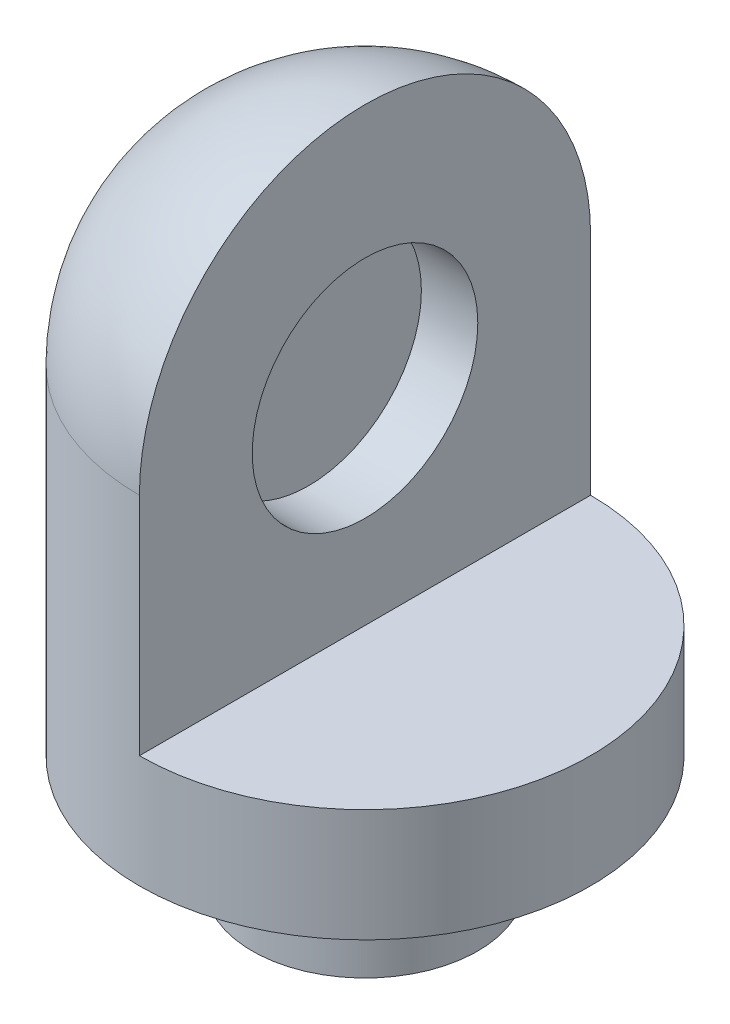
ISO-10303-21;
HEADER;
FILE_DESCRIPTION(('STEP AP214'),'2;1');
FILE_NAME('part.step','',(''),(''),'','','');
FILE_SCHEMA(('AUTOMOTIVE_DESIGN { 1 0 10303 214 1 1 1 1 }'));
ENDSEC;
DATA;
#1=APPLICATION_CONTEXT('core data for automotive mechanical design processes');
#2=APPLICATION_PROTOCOL_DEFINITION('international standard','automotive_design',2000,#1);
#3=PRODUCT_CONTEXT('',#1,'mechanical');
#4=PRODUCT('Part','Part','',(#3));
#5=PRODUCT_RELATED_PRODUCT_CATEGORY('part','',(#4));
#6=PRODUCT_DEFINITION_FORMATION('','',#4);
#7=PRODUCT_DEFINITION_CONTEXT('part definition',#1,'design');
#8=PRODUCT_DEFINITION('design','',#6,#7);
#9=PRODUCT_DEFINITION_SHAPE('','',#8);
#10=(LENGTH_UNIT() NAMED_UNIT(*) SI_UNIT(.MILLI.,.METRE.));
#11=(NAMED_UNIT(*) PLANE_ANGLE_UNIT() SI_UNIT($,.RADIAN.));
#12=(NAMED_UNIT(*) SI_UNIT($,.STERADIAN.) SOLID_ANGLE_UNIT());
#13=UNCERTAINTY_MEASURE_WITH_UNIT(LENGTH_MEASURE(1.E-05),#10,'distance_accuracy_value','');
#14=(GEOMETRIC_REPRESENTATION_CONTEXT(3) GLOBAL_UNCERTAINTY_ASSIGNED_CONTEXT((#13)) GLOBAL_UNIT_ASSIGNED_CONTEXT((#10,
#11,#12)) REPRESENTATION_CONTEXT('',''));
#15=CARTESIAN_POINT('',(0.,0.,0.));
#16=DIRECTION('',(0.,0.,1.));
#17=DIRECTION('',(1.,0.,0.));
#18=AXIS2_PLACEMENT_3D('',#15,#16,#17);
#19=CARTESIAN_POINT('',(0.,100.,0.));
#20=DIRECTION('',(0.,-1.,0.));
#21=DIRECTION('',(0.,0.,-1.));
#22=AXIS2_PLACEMENT_3D('',#19,#20,#21);
#23=CYLINDRICAL_SURFACE('',#22,40.);
#24=CARTESIAN_POINT('',(0.,60.,0.));
#25=DIRECTION('',(0.,-1.,0.));
#26=DIRECTION('',(0.,0.,-1.));
#27=AXIS2_PLACEMENT_3D('',#24,#25,#26);
#28=CIRCLE('',#27,40.);
#29=CARTESIAN_POINT('',(0.,60.,40.));
#30=VERTEX_POINT('',#29);
#31=CARTESIAN_POINT('',(0.,60.,-40.));
#32=VERTEX_POINT('',#31);
#33=EDGE_CURVE('E71',#30,#32,#28,.T.);
#34=ORIENTED_EDGE('',*,*,#33,.T.);
#35=DIRECTION('',(0.,1.,0.));
#36=VECTOR('',#35,1.);
#37=CARTESIAN_POINT('',(0.,19.9999999999999,-40.));
#38=LINE('',#37,#36);
#39=CARTESIAN_POINT('',(0.,19.9999999999999,-40.));
#40=VERTEX_POINT('',#39);
#41=EDGE_CURVE('E64',#40,#32,#38,.T.);
#42=ORIENTED_EDGE('',*,*,#41,.F.);
#43=CARTESIAN_POINT('',(0.,19.9999999999999,0.));
#44=DIRECTION('',(0.,1.,0.));
#45=DIRECTION('',(0.,0.,1.));
#46=AXIS2_PLACEMENT_3D('',#43,#44,#45);
#47=CIRCLE('',#46,40.);
#48=CARTESIAN_POINT('',(0.,19.9999999999999,40.));
#49=VERTEX_POINT('',#48);
#50=EDGE_CURVE('E11',#49,#40,#47,.T.);
#51=ORIENTED_EDGE('',*,*,#50,.F.);
#52=DIRECTION('',(0.,1.,0.));
#53=VECTOR('',#52,1.);
#54=CARTESIAN_POINT('',(0.,19.9999999999999,40.));
#55=LINE('',#54,#53);
#56=EDGE_CURVE('E56',#49,#30,#55,.T.);
#57=ORIENTED_EDGE('',*,*,#56,.T.);
#58=EDGE_LOOP('',(#34,#42,#51,#57));
#59=FACE_BOUND('',#58,.T.);
#60=CARTESIAN_POINT('',(0.,0.,0.));
#61=DIRECTION('',(0.,1.,0.));
#62=DIRECTION('',(0.,0.,1.));
#63=AXIS2_PLACEMENT_3D('',#60,#61,#62);
#64=CIRCLE('',#63,40.);
#65=CARTESIAN_POINT('',(0.,0.,40.));
#66=VERTEX_POINT('',#65);
#67=EDGE_CURVE('E75',#66,#66,#64,.T.);
#68=ORIENTED_EDGE('',*,*,#67,.T.);
#69=EDGE_LOOP('',(#68));
#70=FACE_BOUND('',#69,.T.);
#71=ADVANCED_FACE('F33',(#59,#70),#23,.T.);
#72=CARTESIAN_POINT('',(0.,0.,0.));
#73=DIRECTION('',(0.,1.,0.));
#74=DIRECTION('',(0.,0.,1.));
#75=AXIS2_PLACEMENT_3D('',#72,#73,#74);
#76=PLANE('',#75);
#77=CARTESIAN_POINT('',(0.,0.,0.));
#78=DIRECTION('',(0.,-1.,0.));
#79=DIRECTION('',(0.,0.,-1.));
#80=AXIS2_PLACEMENT_3D('',#77,#78,#79);
#81=CIRCLE('',#80,20.);
#82=CARTESIAN_POINT('',(0.,0.,-20.));
#83=VERTEX_POINT('',#82);
#84=EDGE_CURVE('E79',#83,#83,#81,.T.);
#85=ORIENTED_EDGE('',*,*,#84,.F.);
#86=EDGE_LOOP('',(#85));
#87=FACE_BOUND('',#86,.T.);
#88=ORIENTED_EDGE('',*,*,#67,.F.);
#89=EDGE_LOOP('',(#88));
#90=FACE_BOUND('',#89,.T.);
#91=ADVANCED_FACE('F86',(#87,#90),#76,.F.);
#92=CARTESIAN_POINT('',(0.,-20.,0.));
#93=DIRECTION('',(0.,1.,0.));
#94=DIRECTION('',(0.,0.,1.));
#95=AXIS2_PLACEMENT_3D('',#92,#93,#94);
#96=CYLINDRICAL_SURFACE('',#95,20.);
#97=CARTESIAN_POINT('',(0.,-20.,0.));
#98=DIRECTION('',(0.,-1.,0.));
#99=DIRECTION('',(0.,0.,-1.));
#100=AXIS2_PLACEMENT_3D('',#97,#98,#99);
#101=CIRCLE('',#100,20.);
#102=CARTESIAN_POINT('',(0.,-20.,-20.));
#103=VERTEX_POINT('',#102);
#104=EDGE_CURVE('E72',#103,#103,#101,.T.);
#105=ORIENTED_EDGE('',*,*,#104,.F.);
#106=EDGE_LOOP('',(#105));
#107=FACE_BOUND('',#106,.T.);
#108=ORIENTED_EDGE('',*,*,#84,.T.);
#109=EDGE_LOOP('',(#108));
#110=FACE_BOUND('',#109,.T.);
#111=ADVANCED_FACE('F88',(#107,#110),#96,.T.);
#112=CARTESIAN_POINT('',(0.,-20.,0.));
#113=DIRECTION('',(0.,-1.,0.));
#114=DIRECTION('',(0.,0.,-1.));
#115=AXIS2_PLACEMENT_3D('',#112,#113,#114);
#116=PLANE('',#115);
#117=ORIENTED_EDGE('',*,*,#104,.T.);
#118=EDGE_LOOP('',(#117));
#119=FACE_BOUND('',#118,.T.);
#120=ADVANCED_FACE('F95',(#119),#116,.T.);
#121=CARTESIAN_POINT('',(0.,60.,0.));
#122=DIRECTION('',(0.,1.,0.));
#123=DIRECTION('',(0.,0.,1.));
#124=AXIS2_PLACEMENT_3D('',#121,#122,#123);
#125=SPHERICAL_SURFACE('',#124,40.);
#126=CARTESIAN_POINT('',(0.,60.,0.));
#127=DIRECTION('',(-1.,0.,0.));
#128=DIRECTION('',(0.,0.,1.));
#129=AXIS2_PLACEMENT_3D('',#126,#127,#128);
#130=CIRCLE('',#129,40.);
#131=EDGE_CURVE('E41',#32,#30,#130,.F.);
#132=ORIENTED_EDGE('',*,*,#131,.F.);
#133=ORIENTED_EDGE('',*,*,#33,.F.);
#134=EDGE_LOOP('',(#132,#133));
#135=FACE_BOUND('',#134,.T.);
#136=ADVANCED_FACE('F35',(#135),#125,.T.);
#137=CARTESIAN_POINT('',(0.,19.9999999999999,0.));
#138=DIRECTION('',(0.,1.,0.));
#139=DIRECTION('',(0.,0.,1.));
#140=AXIS2_PLACEMENT_3D('',#137,#138,#139);
#141=PLANE('',#140);
#142=ORIENTED_EDGE('',*,*,#50,.T.);
#143=DIRECTION('',(0.,0.,1.));
#144=VECTOR('',#143,1.);
#145=CARTESIAN_POINT('',(0.,19.9999999999999,-40.));
#146=LINE('',#145,#144);
#147=EDGE_CURVE('E59',#40,#49,#146,.T.);
#148=ORIENTED_EDGE('',*,*,#147,.T.);
#149=EDGE_LOOP('',(#142,#148));
#150=FACE_BOUND('',#149,.T.);
#151=ADVANCED_FACE('F67',(#150),#141,.T.);
#152=CARTESIAN_POINT('',(0.,19.9999999999999,-40.));
#153=DIRECTION('',(-1.,0.,0.));
#154=DIRECTION('',(0.,0.,1.));
#155=AXIS2_PLACEMENT_3D('',#152,#153,#154);
#156=PLANE('',#155);
#157=CARTESIAN_POINT('',(0.,56.4426207755356,0.));
#158=DIRECTION('',(1.,0.,0.));
#159=DIRECTION('',(0.,0.,-1.));
#160=AXIS2_PLACEMENT_3D('',#157,#158,#159);
#161=CIRCLE('',#160,20.);
#162=CARTESIAN_POINT('',(0.,56.4426207755356,-20.));
#163=VERTEX_POINT('',#162);
#164=EDGE_CURVE('E119',#163,#163,#161,.T.);
#165=ORIENTED_EDGE('',*,*,#164,.F.);
#166=EDGE_LOOP('',(#165));
#167=FACE_BOUND('',#166,.T.);
#168=ORIENTED_EDGE('',*,*,#41,.T.);
#169=ORIENTED_EDGE('',*,*,#131,.T.);
#170=ORIENTED_EDGE('',*,*,#56,.F.);
#171=ORIENTED_EDGE('',*,*,#147,.F.);
#172=EDGE_LOOP('',(#168,#169,#170,#171));
#173=FACE_BOUND('',#172,.T.);
#174=ADVANCED_FACE('F58',(#167,#173),#156,.F.);
#175=CARTESIAN_POINT('',(-10.,56.4426207755356,0.));
#176=DIRECTION('',(1.,0.,0.));
#177=DIRECTION('',(0.,0.,-1.));
#178=AXIS2_PLACEMENT_3D('',#175,#176,#177);
#179=CYLINDRICAL_SURFACE('',#178,20.);
#180=CARTESIAN_POINT('',(-10.,56.4426207755356,0.));
#181=DIRECTION('',(1.,0.,0.));
#182=DIRECTION('',(0.,0.,-1.));
#183=AXIS2_PLACEMENT_3D('',#180,#181,#182);
#184=CIRCLE('',#183,20.);
#185=CARTESIAN_POINT('',(-10.,56.4426207755356,-20.));
#186=VERTEX_POINT('',#185);
#187=EDGE_CURVE('E68',#186,#186,#184,.T.);
#188=ORIENTED_EDGE('',*,*,#187,.F.);
#189=EDGE_LOOP('',(#188));
#190=FACE_BOUND('',#189,.T.);
#191=ORIENTED_EDGE('',*,*,#164,.T.);
#192=EDGE_LOOP('',(#191));
#193=FACE_BOUND('',#192,.T.);
#194=ADVANCED_FACE('F105',(#190,#193),#179,.F.);
#195=CARTESIAN_POINT('',(-10.,56.4426207755356,0.));
#196=DIRECTION('',(1.,0.,0.));
#197=DIRECTION('',(0.,0.,-1.));
#198=AXIS2_PLACEMENT_3D('',#195,#196,#197);
#199=PLANE('',#198);
#200=ORIENTED_EDGE('',*,*,#187,.T.);
#201=EDGE_LOOP('',(#200));
#202=FACE_BOUND('',#201,.T.);
#203=ADVANCED_FACE('F111',(#202),#199,.T.);
#204=CLOSED_SHELL('',(#71,#91,#111,#120,#136,#151,#174,#194,#203));
#205=MANIFOLD_SOLID_BREP('B2',#204);
#206=ADVANCED_BREP_SHAPE_REPRESENTATION('',(#18,#205),#14);
#207=SHAPE_DEFINITION_REPRESENTATION(#9,#206);
ENDSEC;
END-ISO-10303-21;
